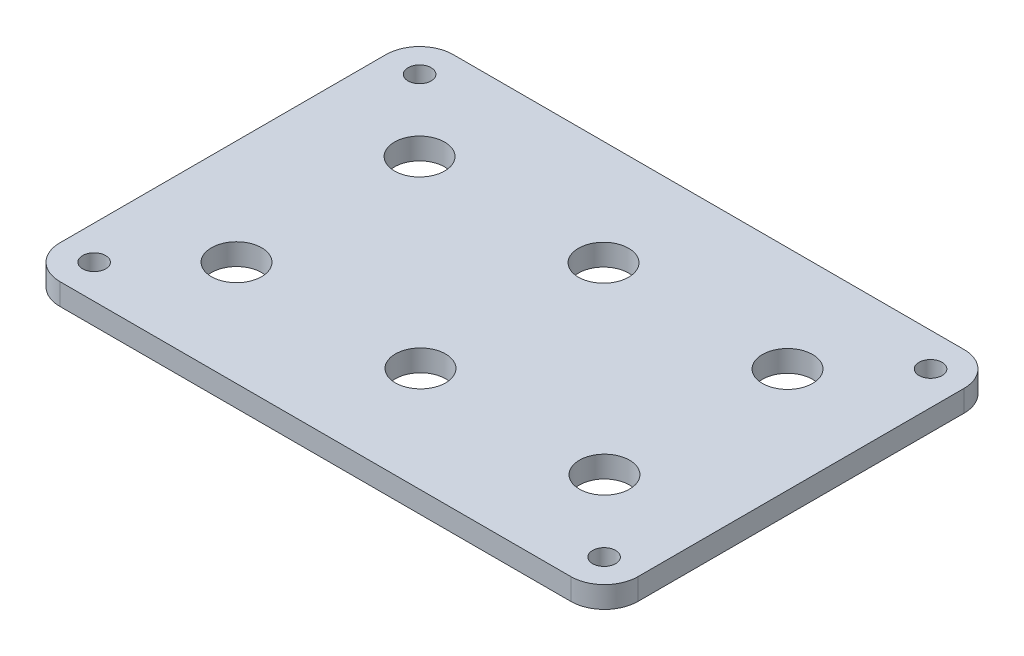
ISO-10303-21;
HEADER;
FILE_DESCRIPTION(('STEP AP214'),'2;1');
FILE_NAME('part.step','',(''),(''),'','','');
FILE_SCHEMA(('AUTOMOTIVE_DESIGN { 1 0 10303 214 1 1 1 1 }'));
ENDSEC;
DATA;
#1=APPLICATION_CONTEXT('core data for automotive mechanical design processes');
#2=APPLICATION_PROTOCOL_DEFINITION('international standard','automotive_design',2000,#1);
#3=PRODUCT_CONTEXT('',#1,'mechanical');
#4=PRODUCT('Part','Part','',(#3));
#5=PRODUCT_RELATED_PRODUCT_CATEGORY('part','',(#4));
#6=PRODUCT_DEFINITION_FORMATION('','',#4);
#7=PRODUCT_DEFINITION_CONTEXT('part definition',#1,'design');
#8=PRODUCT_DEFINITION('design','',#6,#7);
#9=PRODUCT_DEFINITION_SHAPE('','',#8);
#10=(LENGTH_UNIT() NAMED_UNIT(*) SI_UNIT(.MILLI.,.METRE.));
#11=(NAMED_UNIT(*) PLANE_ANGLE_UNIT() SI_UNIT($,.RADIAN.));
#12=(NAMED_UNIT(*) SI_UNIT($,.STERADIAN.) SOLID_ANGLE_UNIT());
#13=UNCERTAINTY_MEASURE_WITH_UNIT(LENGTH_MEASURE(1.E-05),#10,'distance_accuracy_value','');
#14=(GEOMETRIC_REPRESENTATION_CONTEXT(3) GLOBAL_UNCERTAINTY_ASSIGNED_CONTEXT((#13)) GLOBAL_UNIT_ASSIGNED_CONTEXT((#10,
#11,#12)) REPRESENTATION_CONTEXT('',''));
#15=CARTESIAN_POINT('',(0.,0.,0.));
#16=DIRECTION('',(0.,0.,1.));
#17=DIRECTION('',(1.,0.,0.));
#18=AXIS2_PLACEMENT_3D('',#15,#16,#17);
#19=CARTESIAN_POINT('',(110.992708305585,3.175,-138.788067041244));
#20=DIRECTION('',(0.,1.,0.));
#21=DIRECTION('',(0.,0.,1.));
#22=AXIS2_PLACEMENT_3D('',#19,#20,#21);
#23=PLANE('',#22);
#24=CARTESIAN_POINT('',(107.445530334738,3.175,-142.285856338533));
#25=DIRECTION('',(0.,1.,0.));
#26=DIRECTION('',(0.,0.,1.));
#27=AXIS2_PLACEMENT_3D('',#24,#25,#26);
#28=CIRCLE('',#27,1.7003914722854);
#29=CARTESIAN_POINT('',(107.445530334738,3.175,-140.585464866248));
#30=VERTEX_POINT('',#29);
#31=EDGE_CURVE('E241',#30,#30,#28,.T.);
#32=ORIENTED_EDGE('',*,*,#31,.F.);
#33=EDGE_LOOP('',(#32));
#34=FACE_BOUND('',#33,.T.);
#35=CARTESIAN_POINT('',(32.1803893114807,3.175,-190.337721151875));
#36=DIRECTION('',(0.,1.,0.));
#37=DIRECTION('',(0.,0.,1.));
#38=AXIS2_PLACEMENT_3D('',#35,#36,#37);
#39=CIRCLE('',#38,1.70038810793461);
#40=CARTESIAN_POINT('',(32.1803893114807,3.175,-188.63733304394));
#41=VERTEX_POINT('',#40);
#42=EDGE_CURVE('E253',#41,#41,#39,.T.);
#43=ORIENTED_EDGE('',*,*,#42,.F.);
#44=EDGE_LOOP('',(#43));
#45=FACE_BOUND('',#44,.T.);
#46=CARTESIAN_POINT('',(69.8111942116733,3.175,-152.83744096114));
#47=DIRECTION('',(0.,1.,0.));
#48=DIRECTION('',(0.,0.,1.));
#49=AXIS2_PLACEMENT_3D('',#46,#47,#48);
#50=CIRCLE('',#49,3.70063813434922);
#51=CARTESIAN_POINT('',(69.8111942116733,3.175,-149.13680282679));
#52=VERTEX_POINT('',#51);
#53=EDGE_CURVE('E265',#52,#52,#50,.T.);
#54=ORIENTED_EDGE('',*,*,#53,.F.);
#55=EDGE_LOOP('',(#54));
#56=FACE_BOUND('',#55,.T.);
#57=CARTESIAN_POINT('',(96.9468602256005,3.175,-179.835523857087));
#58=DIRECTION('',(0.,1.,0.));
#59=DIRECTION('',(0.,0.,1.));
#60=AXIS2_PLACEMENT_3D('',#57,#58,#59);
#61=CIRCLE('',#60,3.70063544286825);
#62=CARTESIAN_POINT('',(96.9468602256005,3.175,-176.134888414218));
#63=VERTEX_POINT('',#62);
#64=EDGE_CURVE('E277',#63,#63,#61,.T.);
#65=ORIENTED_EDGE('',*,*,#64,.F.);
#66=EDGE_LOOP('',(#65));
#67=FACE_BOUND('',#66,.T.);
#68=CARTESIAN_POINT('',(42.6790567291374,3.175,-179.835523857087));
#69=DIRECTION('',(0.,1.,0.));
#70=DIRECTION('',(0.,0.,1.));
#71=AXIS2_PLACEMENT_3D('',#68,#69,#70);
#72=CIRCLE('',#71,3.70063678860866);
#73=CARTESIAN_POINT('',(42.6790567291374,3.175,-176.134887068478));
#74=VERTEX_POINT('',#73);
#75=EDGE_CURVE('E289',#74,#74,#72,.T.);
#76=ORIENTED_EDGE('',*,*,#75,.F.);
#77=EDGE_LOOP('',(#76));
#78=FACE_BOUND('',#77,.T.);
#79=CARTESIAN_POINT('',(107.487861945513,3.175,-137.336384548185));
#80=CARTESIAN_POINT('',(110.22542094548,3.175,-137.336384548185));
#81=CARTESIAN_POINT('',(112.444385415682,3.175,-139.555359784311));
#82=CARTESIAN_POINT('',(112.444385415682,3.175,-142.292918784278));
#83=B_SPLINE_CURVE_WITH_KNOTS('',3,(#79,#80,#81,#82),.UNSPECIFIED.,.F.,.F.,(4,4),(7.,8.),.UNSPECIFIED.);
#84=CARTESIAN_POINT('',(107.487861945513,3.175,-137.336384548185));
#85=VERTEX_POINT('',#84);
#86=CARTESIAN_POINT('',(112.444385415682,3.175,-142.292918784278));
#87=VERTEX_POINT('',#86);
#88=EDGE_CURVE('E294',#85,#87,#83,.T.);
#89=ORIENTED_EDGE('',*,*,#88,.T.);
#90=DIRECTION('',(0.,0.,-1.));
#91=VECTOR('',#90,1.);
#92=CARTESIAN_POINT('',(112.444385415682,3.175,-190.380056799871));
#93=LINE('',#92,#91);
#94=CARTESIAN_POINT('',(112.444385415682,3.175,-190.380056799871));
#95=VERTEX_POINT('',#94);
#96=EDGE_CURVE('E94',#87,#95,#93,.T.);
#97=ORIENTED_EDGE('',*,*,#96,.T.);
#98=CARTESIAN_POINT('',(112.444385415682,3.175,-190.380056799871));
#99=CARTESIAN_POINT('',(112.444385415682,3.175,-193.117615799838));
#100=CARTESIAN_POINT('',(110.22542094548,3.175,-195.336585653002));
#101=CARTESIAN_POINT('',(107.487861945513,3.175,-195.336585653002));
#102=B_SPLINE_CURVE_WITH_KNOTS('',3,(#98,#99,#100,#101),.UNSPECIFIED.,.F.,.F.,(4,4),(5.,6.),.UNSPECIFIED.);
#103=CARTESIAN_POINT('',(107.487861945513,3.175,-195.336585653002));
#104=VERTEX_POINT('',#103);
#105=EDGE_CURVE('E160',#95,#104,#102,.T.);
#106=ORIENTED_EDGE('',*,*,#105,.T.);
#107=DIRECTION('',(-1.,0.,0.));
#108=VECTOR('',#107,1.);
#109=CARTESIAN_POINT('',(32.1345264778333,3.175,-195.336585653002));
#110=LINE('',#109,#108);
#111=CARTESIAN_POINT('',(32.1345264778333,3.175,-195.336585653002));
#112=VERTEX_POINT('',#111);
#113=EDGE_CURVE('E155',#104,#112,#110,.T.);
#114=ORIENTED_EDGE('',*,*,#113,.T.);
#115=CARTESIAN_POINT('',(32.1345264778333,3.175,-195.336585653002));
#116=CARTESIAN_POINT('',(29.3969701693475,3.175,-195.336585653002));
#117=CARTESIAN_POINT('',(27.1779976247024,3.175,-193.117610416876));
#118=CARTESIAN_POINT('',(27.1779976247024,3.175,-190.380056799871));
#119=B_SPLINE_CURVE_WITH_KNOTS('',3,(#115,#116,#117,#118),.UNSPECIFIED.,.F.,.F.,(4,4),(3.,4.),.UNSPECIFIED.);
#120=CARTESIAN_POINT('',(27.1779976247024,3.175,-190.380056799871));
#121=VERTEX_POINT('',#120);
#122=EDGE_CURVE('E113',#112,#121,#119,.T.);
#123=ORIENTED_EDGE('',*,*,#122,.T.);
#124=DIRECTION('',(0.,0.,1.));
#125=VECTOR('',#124,1.);
#126=CARTESIAN_POINT('',(27.1779976247024,3.175,-142.292908018355));
#127=LINE('',#126,#125);
#128=CARTESIAN_POINT('',(27.1779976247024,3.175,-142.292908018355));
#129=VERTEX_POINT('',#128);
#130=EDGE_CURVE('E107',#121,#129,#127,.T.);
#131=ORIENTED_EDGE('',*,*,#130,.T.);
#132=CARTESIAN_POINT('',(27.1779976247024,3.175,-142.292908018355));
#133=CARTESIAN_POINT('',(27.1779976247024,3.175,-139.555359784311));
#134=CARTESIAN_POINT('',(29.3969701693475,3.175,-137.336384548185));
#135=CARTESIAN_POINT('',(32.1345264778333,3.175,-137.336384548185));
#136=B_SPLINE_CURVE_WITH_KNOTS('',3,(#132,#133,#134,#135),.UNSPECIFIED.,.F.,.F.,(4,4),(1.,2.),.UNSPECIFIED.);
#137=CARTESIAN_POINT('',(32.1345264778333,3.175,-137.336384548185));
#138=VERTEX_POINT('',#137);
#139=EDGE_CURVE('E111',#129,#138,#136,.T.);
#140=ORIENTED_EDGE('',*,*,#139,.T.);
#141=DIRECTION('',(1.,0.,0.));
#142=VECTOR('',#141,1.);
#143=CARTESIAN_POINT('',(107.487861945513,3.175,-137.336384548185));
#144=LINE('',#143,#142);
#145=EDGE_CURVE('E51',#138,#85,#144,.T.);
#146=ORIENTED_EDGE('',*,*,#145,.T.);
#147=EDGE_LOOP('',(#89,#97,#106,#114,#123,#131,#140,#146));
#148=FACE_BOUND('',#147,.T.);
#149=CARTESIAN_POINT('',(69.8111942116733,3.175,-179.835523857087));
#150=DIRECTION('',(0.,1.,0.));
#151=DIRECTION('',(0.,0.,1.));
#152=AXIS2_PLACEMENT_3D('',#149,#150,#151);
#153=CIRCLE('',#152,3.70063813434922);
#154=CARTESIAN_POINT('',(69.8111942116733,3.175,-176.134885722737));
#155=VERTEX_POINT('',#154);
#156=EDGE_CURVE('E283',#155,#155,#153,.T.);
#157=ORIENTED_EDGE('',*,*,#156,.F.);
#158=EDGE_LOOP('',(#157));
#159=FACE_BOUND('',#158,.T.);
#160=CARTESIAN_POINT('',(42.6790567291374,3.175,-152.83744096114));
#161=DIRECTION('',(0.,1.,0.));
#162=DIRECTION('',(0.,0.,1.));
#163=AXIS2_PLACEMENT_3D('',#160,#161,#162);
#164=CIRCLE('',#163,3.70063678860866);
#165=CARTESIAN_POINT('',(42.6790567291374,3.175,-149.136804172531));
#166=VERTEX_POINT('',#165);
#167=EDGE_CURVE('E271',#166,#166,#164,.T.);
#168=ORIENTED_EDGE('',*,*,#167,.F.);
#169=EDGE_LOOP('',(#168));
#170=FACE_BOUND('',#169,.T.);
#171=CARTESIAN_POINT('',(96.9468602256005,3.175,-152.83744096114));
#172=DIRECTION('',(0.,1.,0.));
#173=DIRECTION('',(0.,0.,1.));
#174=AXIS2_PLACEMENT_3D('',#171,#172,#173);
#175=CIRCLE('',#174,3.70063544286825);
#176=CARTESIAN_POINT('',(96.9468602256005,3.175,-149.136805518271));
#177=VERTEX_POINT('',#176);
#178=EDGE_CURVE('E259',#177,#177,#175,.T.);
#179=ORIENTED_EDGE('',*,*,#178,.F.);
#180=EDGE_LOOP('',(#179));
#181=FACE_BOUND('',#180,.T.);
#182=CARTESIAN_POINT('',(32.1803893114807,3.175,-142.338781617925));
#183=DIRECTION('',(0.,1.,0.));
#184=DIRECTION('',(0.,0.,1.));
#185=AXIS2_PLACEMENT_3D('',#182,#183,#184);
#186=CIRCLE('',#185,1.70039012654498);
#187=CARTESIAN_POINT('',(32.1803893114807,3.175,-140.638391491381));
#188=VERTEX_POINT('',#187);
#189=EDGE_CURVE('E247',#188,#188,#186,.T.);
#190=ORIENTED_EDGE('',*,*,#189,.F.);
#191=EDGE_LOOP('',(#190));
#192=FACE_BOUND('',#191,.T.);
#193=CARTESIAN_POINT('',(107.494913625334,3.175,-190.387108479693));
#194=DIRECTION('',(0.,1.,0.));
#195=DIRECTION('',(0.,0.,1.));
#196=AXIS2_PLACEMENT_3D('',#193,#194,#195);
#197=CIRCLE('',#196,1.7003914722854);
#198=CARTESIAN_POINT('',(107.494913625334,3.175,-188.686717007407));
#199=VERTEX_POINT('',#198);
#200=EDGE_CURVE('E232',#199,#199,#197,.T.);
#201=ORIENTED_EDGE('',*,*,#200,.F.);
#202=EDGE_LOOP('',(#201));
#203=FACE_BOUND('',#202,.T.);
#204=ADVANCED_FACE('F33',(#34,#45,#56,#67,#78,#148,#159,#170,#181,#192,#203),#23,.T.);
#205=CARTESIAN_POINT('',(110.992708305585,0.,-138.788067041244));
#206=DIRECTION('',(0.,1.,0.));
#207=DIRECTION('',(0.,0.,1.));
#208=AXIS2_PLACEMENT_3D('',#205,#206,#207);
#209=PLANE('',#208);
#210=CARTESIAN_POINT('',(107.487861945513,0.,-137.336384548185));
#211=CARTESIAN_POINT('',(110.22542094548,0.,-137.336384548185));
#212=CARTESIAN_POINT('',(112.444385415682,0.,-139.555359784311));
#213=CARTESIAN_POINT('',(112.444385415682,0.,-142.292918784278));
#214=B_SPLINE_CURVE_WITH_KNOTS('',3,(#210,#211,#212,#213),.UNSPECIFIED.,.F.,.F.,(4,4),(7.,8.),.UNSPECIFIED.);
#215=CARTESIAN_POINT('',(107.487861945513,0.,-137.336384548185));
#216=VERTEX_POINT('',#215);
#217=CARTESIAN_POINT('',(112.444385415682,0.,-142.292918784278));
#218=VERTEX_POINT('',#217);
#219=EDGE_CURVE('E292',#216,#218,#214,.T.);
#220=ORIENTED_EDGE('',*,*,#219,.F.);
#221=DIRECTION('',(1.,0.,0.));
#222=VECTOR('',#221,1.);
#223=CARTESIAN_POINT('',(107.487861945513,0.,-137.336384548185));
#224=LINE('',#223,#222);
#225=CARTESIAN_POINT('',(32.1345264778333,0.,-137.336384548185));
#226=VERTEX_POINT('',#225);
#227=EDGE_CURVE('E86',#226,#216,#224,.T.);
#228=ORIENTED_EDGE('',*,*,#227,.F.);
#229=CARTESIAN_POINT('',(27.1779976247024,0.,-142.292908018355));
#230=CARTESIAN_POINT('',(27.1779976247024,0.,-139.555359784311));
#231=CARTESIAN_POINT('',(29.3969701693475,0.,-137.336384548185));
#232=CARTESIAN_POINT('',(32.1345264778333,0.,-137.336384548185));
#233=B_SPLINE_CURVE_WITH_KNOTS('',3,(#229,#230,#231,#232),.UNSPECIFIED.,.F.,.F.,(4,4),(1.,2.),.UNSPECIFIED.);
#234=CARTESIAN_POINT('',(27.1779976247024,0.,-142.292908018355));
#235=VERTEX_POINT('',#234);
#236=EDGE_CURVE('E80',#235,#226,#233,.T.);
#237=ORIENTED_EDGE('',*,*,#236,.F.);
#238=DIRECTION('',(0.,0.,1.));
#239=VECTOR('',#238,1.);
#240=CARTESIAN_POINT('',(27.1779976247024,0.,-142.292908018355));
#241=LINE('',#240,#239);
#242=CARTESIAN_POINT('',(27.1779976247024,0.,-190.380056799871));
#243=VERTEX_POINT('',#242);
#244=EDGE_CURVE('E121',#243,#235,#241,.T.);
#245=ORIENTED_EDGE('',*,*,#244,.F.);
#246=CARTESIAN_POINT('',(32.1345264778333,0.,-195.336585653002));
#247=CARTESIAN_POINT('',(29.3969701693475,0.,-195.336585653002));
#248=CARTESIAN_POINT('',(27.1779976247024,0.,-193.117610416876));
#249=CARTESIAN_POINT('',(27.1779976247024,0.,-190.380056799871));
#250=B_SPLINE_CURVE_WITH_KNOTS('',3,(#246,#247,#248,#249),.UNSPECIFIED.,.F.,.F.,(4,4),(3.,4.),.UNSPECIFIED.);
#251=CARTESIAN_POINT('',(32.1345264778333,0.,-195.336585653002));
#252=VERTEX_POINT('',#251);
#253=EDGE_CURVE('E329',#252,#243,#250,.T.);
#254=ORIENTED_EDGE('',*,*,#253,.F.);
#255=DIRECTION('',(-1.,0.,0.));
#256=VECTOR('',#255,1.);
#257=CARTESIAN_POINT('',(32.1345264778333,0.,-195.336585653002));
#258=LINE('',#257,#256);
#259=CARTESIAN_POINT('',(107.487861945513,0.,-195.336585653002));
#260=VERTEX_POINT('',#259);
#261=EDGE_CURVE('E327',#260,#252,#258,.T.);
#262=ORIENTED_EDGE('',*,*,#261,.F.);
#263=CARTESIAN_POINT('',(112.444385415682,0.,-190.380056799871));
#264=CARTESIAN_POINT('',(112.444385415682,0.,-193.117615799838));
#265=CARTESIAN_POINT('',(110.22542094548,0.,-195.336585653002));
#266=CARTESIAN_POINT('',(107.487861945513,0.,-195.336585653002));
#267=B_SPLINE_CURVE_WITH_KNOTS('',3,(#263,#264,#265,#266),.UNSPECIFIED.,.F.,.F.,(4,4),(5.,6.),.UNSPECIFIED.);
#268=CARTESIAN_POINT('',(112.444385415682,0.,-190.380056799871));
#269=VERTEX_POINT('',#268);
#270=EDGE_CURVE('E321',#269,#260,#267,.T.);
#271=ORIENTED_EDGE('',*,*,#270,.F.);
#272=DIRECTION('',(0.,0.,-1.));
#273=VECTOR('',#272,1.);
#274=CARTESIAN_POINT('',(112.444385415682,0.,-190.380056799871));
#275=LINE('',#274,#273);
#276=EDGE_CURVE('E325',#218,#269,#275,.T.);
#277=ORIENTED_EDGE('',*,*,#276,.F.);
#278=EDGE_LOOP('',(#220,#228,#237,#245,#254,#262,#271,#277));
#279=FACE_BOUND('',#278,.T.);
#280=CARTESIAN_POINT('',(42.6790567291374,0.,-179.835523857087));
#281=DIRECTION('',(0.,1.,0.));
#282=DIRECTION('',(0.,0.,1.));
#283=AXIS2_PLACEMENT_3D('',#280,#281,#282);
#284=CIRCLE('',#283,3.70063678860866);
#285=CARTESIAN_POINT('',(42.6790567291374,0.,-176.134887068478));
#286=VERTEX_POINT('',#285);
#287=EDGE_CURVE('E286',#286,#286,#284,.T.);
#288=ORIENTED_EDGE('',*,*,#287,.T.);
#289=EDGE_LOOP('',(#288));
#290=FACE_BOUND('',#289,.T.);
#291=CARTESIAN_POINT('',(69.8111942116733,0.,-179.835523857087));
#292=DIRECTION('',(0.,1.,0.));
#293=DIRECTION('',(0.,0.,1.));
#294=AXIS2_PLACEMENT_3D('',#291,#292,#293);
#295=CIRCLE('',#294,3.70063813434922);
#296=CARTESIAN_POINT('',(69.8111942116733,0.,-176.134885722737));
#297=VERTEX_POINT('',#296);
#298=EDGE_CURVE('E280',#297,#297,#295,.T.);
#299=ORIENTED_EDGE('',*,*,#298,.T.);
#300=EDGE_LOOP('',(#299));
#301=FACE_BOUND('',#300,.T.);
#302=CARTESIAN_POINT('',(96.9468602256005,0.,-179.835523857087));
#303=DIRECTION('',(0.,1.,0.));
#304=DIRECTION('',(0.,0.,1.));
#305=AXIS2_PLACEMENT_3D('',#302,#303,#304);
#306=CIRCLE('',#305,3.70063544286825);
#307=CARTESIAN_POINT('',(96.9468602256005,0.,-176.134888414218));
#308=VERTEX_POINT('',#307);
#309=EDGE_CURVE('E274',#308,#308,#306,.T.);
#310=ORIENTED_EDGE('',*,*,#309,.T.);
#311=EDGE_LOOP('',(#310));
#312=FACE_BOUND('',#311,.T.);
#313=CARTESIAN_POINT('',(42.6790567291374,0.,-152.83744096114));
#314=DIRECTION('',(0.,1.,0.));
#315=DIRECTION('',(0.,0.,1.));
#316=AXIS2_PLACEMENT_3D('',#313,#314,#315);
#317=CIRCLE('',#316,3.70063678860866);
#318=CARTESIAN_POINT('',(42.6790567291374,0.,-149.136804172531));
#319=VERTEX_POINT('',#318);
#320=EDGE_CURVE('E268',#319,#319,#317,.T.);
#321=ORIENTED_EDGE('',*,*,#320,.T.);
#322=EDGE_LOOP('',(#321));
#323=FACE_BOUND('',#322,.T.);
#324=CARTESIAN_POINT('',(69.8111942116733,0.,-152.83744096114));
#325=DIRECTION('',(0.,1.,0.));
#326=DIRECTION('',(0.,0.,1.));
#327=AXIS2_PLACEMENT_3D('',#324,#325,#326);
#328=CIRCLE('',#327,3.70063813434922);
#329=CARTESIAN_POINT('',(69.8111942116733,0.,-149.13680282679));
#330=VERTEX_POINT('',#329);
#331=EDGE_CURVE('E262',#330,#330,#328,.T.);
#332=ORIENTED_EDGE('',*,*,#331,.T.);
#333=EDGE_LOOP('',(#332));
#334=FACE_BOUND('',#333,.T.);
#335=CARTESIAN_POINT('',(96.9468602256005,0.,-152.83744096114));
#336=DIRECTION('',(0.,1.,0.));
#337=DIRECTION('',(0.,0.,1.));
#338=AXIS2_PLACEMENT_3D('',#335,#336,#337);
#339=CIRCLE('',#338,3.70063544286825);
#340=CARTESIAN_POINT('',(96.9468602256005,0.,-149.136805518271));
#341=VERTEX_POINT('',#340);
#342=EDGE_CURVE('E256',#341,#341,#339,.T.);
#343=ORIENTED_EDGE('',*,*,#342,.T.);
#344=EDGE_LOOP('',(#343));
#345=FACE_BOUND('',#344,.T.);
#346=CARTESIAN_POINT('',(32.1803893114807,0.,-190.337721151875));
#347=DIRECTION('',(0.,1.,0.));
#348=DIRECTION('',(0.,0.,1.));
#349=AXIS2_PLACEMENT_3D('',#346,#347,#348);
#350=CIRCLE('',#349,1.70038810793461);
#351=CARTESIAN_POINT('',(32.1803893114807,0.,-188.63733304394));
#352=VERTEX_POINT('',#351);
#353=EDGE_CURVE('E250',#352,#352,#350,.T.);
#354=ORIENTED_EDGE('',*,*,#353,.T.);
#355=EDGE_LOOP('',(#354));
#356=FACE_BOUND('',#355,.T.);
#357=CARTESIAN_POINT('',(32.1803893114807,0.,-142.338781617925));
#358=DIRECTION('',(0.,1.,0.));
#359=DIRECTION('',(0.,0.,1.));
#360=AXIS2_PLACEMENT_3D('',#357,#358,#359);
#361=CIRCLE('',#360,1.70039012654498);
#362=CARTESIAN_POINT('',(32.1803893114807,0.,-140.638391491381));
#363=VERTEX_POINT('',#362);
#364=EDGE_CURVE('E244',#363,#363,#361,.T.);
#365=ORIENTED_EDGE('',*,*,#364,.T.);
#366=EDGE_LOOP('',(#365));
#367=FACE_BOUND('',#366,.T.);
#368=CARTESIAN_POINT('',(107.445530334738,0.,-142.285856338533));
#369=DIRECTION('',(0.,1.,0.));
#370=DIRECTION('',(0.,0.,1.));
#371=AXIS2_PLACEMENT_3D('',#368,#369,#370);
#372=CIRCLE('',#371,1.7003914722854);
#373=CARTESIAN_POINT('',(107.445530334738,0.,-140.585464866248));
#374=VERTEX_POINT('',#373);
#375=EDGE_CURVE('E238',#374,#374,#372,.T.);
#376=ORIENTED_EDGE('',*,*,#375,.T.);
#377=EDGE_LOOP('',(#376));
#378=FACE_BOUND('',#377,.T.);
#379=CARTESIAN_POINT('',(107.494913625334,0.,-190.387108479693));
#380=DIRECTION('',(0.,1.,0.));
#381=DIRECTION('',(0.,0.,1.));
#382=AXIS2_PLACEMENT_3D('',#379,#380,#381);
#383=CIRCLE('',#382,1.7003914722854);
#384=CARTESIAN_POINT('',(107.494913625334,0.,-188.686717007407));
#385=VERTEX_POINT('',#384);
#386=EDGE_CURVE('E235',#385,#385,#383,.T.);
#387=ORIENTED_EDGE('',*,*,#386,.T.);
#388=EDGE_LOOP('',(#387));
#389=FACE_BOUND('',#388,.T.);
#390=ADVANCED_FACE('F176',(#279,#290,#301,#312,#323,#334,#345,#356,#367,#378,#389),#209,.F.);
#391=DIRECTION('',(0.,-1.,0.));
#392=VECTOR('',#391,1.);
#393=SURFACE_OF_LINEAR_EXTRUSION('',#83,#392);
#394=ORIENTED_EDGE('',*,*,#219,.T.);
#395=DIRECTION('',(0.,-1.,0.));
#396=VECTOR('',#395,1.);
#397=CARTESIAN_POINT('',(112.444385415682,3.175,-142.292918784278));
#398=LINE('',#397,#396);
#399=EDGE_CURVE('E11',#87,#218,#398,.T.);
#400=ORIENTED_EDGE('',*,*,#399,.F.);
#401=ORIENTED_EDGE('',*,*,#88,.F.);
#402=DIRECTION('',(0.,-1.,0.));
#403=VECTOR('',#402,1.);
#404=CARTESIAN_POINT('',(107.487861945513,3.175,-137.336384548185));
#405=LINE('',#404,#403);
#406=EDGE_CURVE('E127',#85,#216,#405,.T.);
#407=ORIENTED_EDGE('',*,*,#406,.T.);
#408=EDGE_LOOP('',(#394,#400,#401,#407));
#409=FACE_BOUND('',#408,.T.);
#410=ADVANCED_FACE('F35',(#409),#393,.F.);
#411=CARTESIAN_POINT('',(112.444385415682,3.175,-190.380056799871));
#412=DIRECTION('',(-1.,0.,0.));
#413=DIRECTION('',(0.,0.,1.));
#414=AXIS2_PLACEMENT_3D('',#411,#412,#413);
#415=PLANE('',#414);
#416=ORIENTED_EDGE('',*,*,#276,.T.);
#417=DIRECTION('',(0.,-1.,0.));
#418=VECTOR('',#417,1.);
#419=CARTESIAN_POINT('',(112.444385415682,3.175,-190.380056799871));
#420=LINE('',#419,#418);
#421=EDGE_CURVE('E43',#95,#269,#420,.T.);
#422=ORIENTED_EDGE('',*,*,#421,.F.);
#423=ORIENTED_EDGE('',*,*,#96,.F.);
#424=ORIENTED_EDGE('',*,*,#399,.T.);
#425=EDGE_LOOP('',(#416,#422,#423,#424));
#426=FACE_BOUND('',#425,.T.);
#427=ADVANCED_FACE('F170',(#426),#415,.F.);
#428=DIRECTION('',(0.,-1.,0.));
#429=VECTOR('',#428,1.);
#430=SURFACE_OF_LINEAR_EXTRUSION('',#102,#429);
#431=ORIENTED_EDGE('',*,*,#270,.T.);
#432=DIRECTION('',(0.,-1.,0.));
#433=VECTOR('',#432,1.);
#434=CARTESIAN_POINT('',(107.487861945513,3.175,-195.336585653002));
#435=LINE('',#434,#433);
#436=EDGE_CURVE('E315',#104,#260,#435,.T.);
#437=ORIENTED_EDGE('',*,*,#436,.F.);
#438=ORIENTED_EDGE('',*,*,#105,.F.);
#439=ORIENTED_EDGE('',*,*,#421,.T.);
#440=EDGE_LOOP('',(#431,#437,#438,#439));
#441=FACE_BOUND('',#440,.T.);
#442=ADVANCED_FACE('F168',(#441),#430,.F.);
#443=CARTESIAN_POINT('',(32.1345264778333,3.175,-195.336585653002));
#444=DIRECTION('',(0.,0.,1.));
#445=DIRECTION('',(1.,0.,0.));
#446=AXIS2_PLACEMENT_3D('',#443,#444,#445);
#447=PLANE('',#446);
#448=ORIENTED_EDGE('',*,*,#261,.T.);
#449=DIRECTION('',(0.,-1.,0.));
#450=VECTOR('',#449,1.);
#451=CARTESIAN_POINT('',(32.1345264778333,3.175,-195.336585653002));
#452=LINE('',#451,#450);
#453=EDGE_CURVE('E312',#112,#252,#452,.T.);
#454=ORIENTED_EDGE('',*,*,#453,.F.);
#455=ORIENTED_EDGE('',*,*,#113,.F.);
#456=ORIENTED_EDGE('',*,*,#436,.T.);
#457=EDGE_LOOP('',(#448,#454,#455,#456));
#458=FACE_BOUND('',#457,.T.);
#459=ADVANCED_FACE('F148',(#458),#447,.F.);
#460=DIRECTION('',(0.,-1.,0.));
#461=VECTOR('',#460,1.);
#462=SURFACE_OF_LINEAR_EXTRUSION('',#119,#461);
#463=ORIENTED_EDGE('',*,*,#253,.T.);
#464=DIRECTION('',(0.,-1.,0.));
#465=VECTOR('',#464,1.);
#466=CARTESIAN_POINT('',(27.1779976247024,3.175,-190.380056799871));
#467=LINE('',#466,#465);
#468=EDGE_CURVE('E122',#121,#243,#467,.T.);
#469=ORIENTED_EDGE('',*,*,#468,.F.);
#470=ORIENTED_EDGE('',*,*,#122,.F.);
#471=ORIENTED_EDGE('',*,*,#453,.T.);
#472=EDGE_LOOP('',(#463,#469,#470,#471));
#473=FACE_BOUND('',#472,.T.);
#474=ADVANCED_FACE('F145',(#473),#462,.F.);
#475=CARTESIAN_POINT('',(27.1779976247024,3.175,-142.292908018355));
#476=DIRECTION('',(1.,0.,0.));
#477=DIRECTION('',(0.,0.,-1.));
#478=AXIS2_PLACEMENT_3D('',#475,#476,#477);
#479=PLANE('',#478);
#480=ORIENTED_EDGE('',*,*,#244,.T.);
#481=DIRECTION('',(0.,-1.,0.));
#482=VECTOR('',#481,1.);
#483=CARTESIAN_POINT('',(27.1779976247024,3.175,-142.292908018355));
#484=LINE('',#483,#482);
#485=EDGE_CURVE('E118',#129,#235,#484,.T.);
#486=ORIENTED_EDGE('',*,*,#485,.F.);
#487=ORIENTED_EDGE('',*,*,#130,.F.);
#488=ORIENTED_EDGE('',*,*,#468,.T.);
#489=EDGE_LOOP('',(#480,#486,#487,#488));
#490=FACE_BOUND('',#489,.T.);
#491=ADVANCED_FACE('F119',(#490),#479,.F.);
#492=DIRECTION('',(0.,-1.,0.));
#493=VECTOR('',#492,1.);
#494=SURFACE_OF_LINEAR_EXTRUSION('',#136,#493);
#495=ORIENTED_EDGE('',*,*,#236,.T.);
#496=DIRECTION('',(0.,-1.,0.));
#497=VECTOR('',#496,1.);
#498=CARTESIAN_POINT('',(32.1345264778333,3.175,-137.336384548185));
#499=LINE('',#498,#497);
#500=EDGE_CURVE('E123',#138,#226,#499,.T.);
#501=ORIENTED_EDGE('',*,*,#500,.F.);
#502=ORIENTED_EDGE('',*,*,#139,.F.);
#503=ORIENTED_EDGE('',*,*,#485,.T.);
#504=EDGE_LOOP('',(#495,#501,#502,#503));
#505=FACE_BOUND('',#504,.T.);
#506=ADVANCED_FACE('F125',(#505),#494,.F.);
#507=CARTESIAN_POINT('',(107.487861945513,3.175,-137.336384548185));
#508=DIRECTION('',(0.,0.,-1.));
#509=DIRECTION('',(-1.,0.,0.));
#510=AXIS2_PLACEMENT_3D('',#507,#508,#509);
#511=PLANE('',#510);
#512=ORIENTED_EDGE('',*,*,#227,.T.);
#513=ORIENTED_EDGE('',*,*,#406,.F.);
#514=ORIENTED_EDGE('',*,*,#145,.F.);
#515=ORIENTED_EDGE('',*,*,#500,.T.);
#516=EDGE_LOOP('',(#512,#513,#514,#515));
#517=FACE_BOUND('',#516,.T.);
#518=ADVANCED_FACE('F141',(#517),#511,.F.);
#519=CARTESIAN_POINT('',(42.6790567291374,3.175,-179.835523857087));
#520=DIRECTION('',(0.,-1.,0.));
#521=DIRECTION('',(0.,0.,-1.));
#522=AXIS2_PLACEMENT_3D('',#519,#520,#521);
#523=CYLINDRICAL_SURFACE('',#522,3.70063678860866);
#524=ORIENTED_EDGE('',*,*,#75,.T.);
#525=EDGE_LOOP('',(#524));
#526=FACE_BOUND('',#525,.T.);
#527=ORIENTED_EDGE('',*,*,#287,.F.);
#528=EDGE_LOOP('',(#527));
#529=FACE_BOUND('',#528,.T.);
#530=ADVANCED_FACE('F188',(#526,#529),#523,.F.);
#531=CARTESIAN_POINT('',(69.8111942116733,3.175,-179.835523857087));
#532=DIRECTION('',(0.,-1.,0.));
#533=DIRECTION('',(0.,0.,-1.));
#534=AXIS2_PLACEMENT_3D('',#531,#532,#533);
#535=CYLINDRICAL_SURFACE('',#534,3.70063813434922);
#536=ORIENTED_EDGE('',*,*,#156,.T.);
#537=EDGE_LOOP('',(#536));
#538=FACE_BOUND('',#537,.T.);
#539=ORIENTED_EDGE('',*,*,#298,.F.);
#540=EDGE_LOOP('',(#539));
#541=FACE_BOUND('',#540,.T.);
#542=ADVANCED_FACE('F191',(#538,#541),#535,.F.);
#543=CARTESIAN_POINT('',(96.9468602256005,3.175,-179.835523857087));
#544=DIRECTION('',(0.,-1.,0.));
#545=DIRECTION('',(0.,0.,-1.));
#546=AXIS2_PLACEMENT_3D('',#543,#544,#545);
#547=CYLINDRICAL_SURFACE('',#546,3.70063544286825);
#548=ORIENTED_EDGE('',*,*,#64,.T.);
#549=EDGE_LOOP('',(#548));
#550=FACE_BOUND('',#549,.T.);
#551=ORIENTED_EDGE('',*,*,#309,.F.);
#552=EDGE_LOOP('',(#551));
#553=FACE_BOUND('',#552,.T.);
#554=ADVANCED_FACE('F195',(#550,#553),#547,.F.);
#555=CARTESIAN_POINT('',(42.6790567291374,3.175,-152.83744096114));
#556=DIRECTION('',(0.,-1.,0.));
#557=DIRECTION('',(0.,0.,-1.));
#558=AXIS2_PLACEMENT_3D('',#555,#556,#557);
#559=CYLINDRICAL_SURFACE('',#558,3.70063678860866);
#560=ORIENTED_EDGE('',*,*,#167,.T.);
#561=EDGE_LOOP('',(#560));
#562=FACE_BOUND('',#561,.T.);
#563=ORIENTED_EDGE('',*,*,#320,.F.);
#564=EDGE_LOOP('',(#563));
#565=FACE_BOUND('',#564,.T.);
#566=ADVANCED_FACE('F199',(#562,#565),#559,.F.);
#567=CARTESIAN_POINT('',(69.8111942116733,3.175,-152.83744096114));
#568=DIRECTION('',(0.,-1.,0.));
#569=DIRECTION('',(0.,0.,-1.));
#570=AXIS2_PLACEMENT_3D('',#567,#568,#569);
#571=CYLINDRICAL_SURFACE('',#570,3.70063813434922);
#572=ORIENTED_EDGE('',*,*,#53,.T.);
#573=EDGE_LOOP('',(#572));
#574=FACE_BOUND('',#573,.T.);
#575=ORIENTED_EDGE('',*,*,#331,.F.);
#576=EDGE_LOOP('',(#575));
#577=FACE_BOUND('',#576,.T.);
#578=ADVANCED_FACE('F203',(#574,#577),#571,.F.);
#579=CARTESIAN_POINT('',(96.9468602256005,3.175,-152.83744096114));
#580=DIRECTION('',(0.,-1.,0.));
#581=DIRECTION('',(0.,0.,-1.));
#582=AXIS2_PLACEMENT_3D('',#579,#580,#581);
#583=CYLINDRICAL_SURFACE('',#582,3.70063544286825);
#584=ORIENTED_EDGE('',*,*,#178,.T.);
#585=EDGE_LOOP('',(#584));
#586=FACE_BOUND('',#585,.T.);
#587=ORIENTED_EDGE('',*,*,#342,.F.);
#588=EDGE_LOOP('',(#587));
#589=FACE_BOUND('',#588,.T.);
#590=ADVANCED_FACE('F207',(#586,#589),#583,.F.);
#591=CARTESIAN_POINT('',(32.1803893114807,3.175,-190.337721151875));
#592=DIRECTION('',(0.,-1.,0.));
#593=DIRECTION('',(0.,0.,-1.));
#594=AXIS2_PLACEMENT_3D('',#591,#592,#593);
#595=CYLINDRICAL_SURFACE('',#594,1.70038810793461);
#596=ORIENTED_EDGE('',*,*,#42,.T.);
#597=EDGE_LOOP('',(#596));
#598=FACE_BOUND('',#597,.T.);
#599=ORIENTED_EDGE('',*,*,#353,.F.);
#600=EDGE_LOOP('',(#599));
#601=FACE_BOUND('',#600,.T.);
#602=ADVANCED_FACE('F211',(#598,#601),#595,.F.);
#603=CARTESIAN_POINT('',(32.1803893114807,3.175,-142.338781617925));
#604=DIRECTION('',(0.,-1.,0.));
#605=DIRECTION('',(0.,0.,-1.));
#606=AXIS2_PLACEMENT_3D('',#603,#604,#605);
#607=CYLINDRICAL_SURFACE('',#606,1.70039012654498);
#608=ORIENTED_EDGE('',*,*,#189,.T.);
#609=EDGE_LOOP('',(#608));
#610=FACE_BOUND('',#609,.T.);
#611=ORIENTED_EDGE('',*,*,#364,.F.);
#612=EDGE_LOOP('',(#611));
#613=FACE_BOUND('',#612,.T.);
#614=ADVANCED_FACE('F215',(#610,#613),#607,.F.);
#615=CARTESIAN_POINT('',(107.445530334738,3.175,-142.285856338533));
#616=DIRECTION('',(0.,-1.,0.));
#617=DIRECTION('',(0.,0.,-1.));
#618=AXIS2_PLACEMENT_3D('',#615,#616,#617);
#619=CYLINDRICAL_SURFACE('',#618,1.7003914722854);
#620=ORIENTED_EDGE('',*,*,#31,.T.);
#621=EDGE_LOOP('',(#620));
#622=FACE_BOUND('',#621,.T.);
#623=ORIENTED_EDGE('',*,*,#375,.F.);
#624=EDGE_LOOP('',(#623));
#625=FACE_BOUND('',#624,.T.);
#626=ADVANCED_FACE('F219',(#622,#625),#619,.F.);
#627=CARTESIAN_POINT('',(107.494913625334,3.175,-190.387108479693));
#628=DIRECTION('',(0.,-1.,0.));
#629=DIRECTION('',(0.,0.,-1.));
#630=AXIS2_PLACEMENT_3D('',#627,#628,#629);
#631=CYLINDRICAL_SURFACE('',#630,1.7003914722854);
#632=ORIENTED_EDGE('',*,*,#200,.T.);
#633=EDGE_LOOP('',(#632));
#634=FACE_BOUND('',#633,.T.);
#635=ORIENTED_EDGE('',*,*,#386,.F.);
#636=EDGE_LOOP('',(#635));
#637=FACE_BOUND('',#636,.T.);
#638=ADVANCED_FACE('F223',(#634,#637),#631,.F.);
#639=CLOSED_SHELL('',(#204,#390,#410,#427,#442,#459,#474,#491,#506,#518,#530,#542,#554,#566,
#578,#590,#602,#614,#626,#638));
#640=MANIFOLD_SOLID_BREP('B2',#639);
#641=ADVANCED_BREP_SHAPE_REPRESENTATION('',(#18,#640),#14);
#642=SHAPE_DEFINITION_REPRESENTATION(#9,#641);
ENDSEC;
END-ISO-10303-21;
